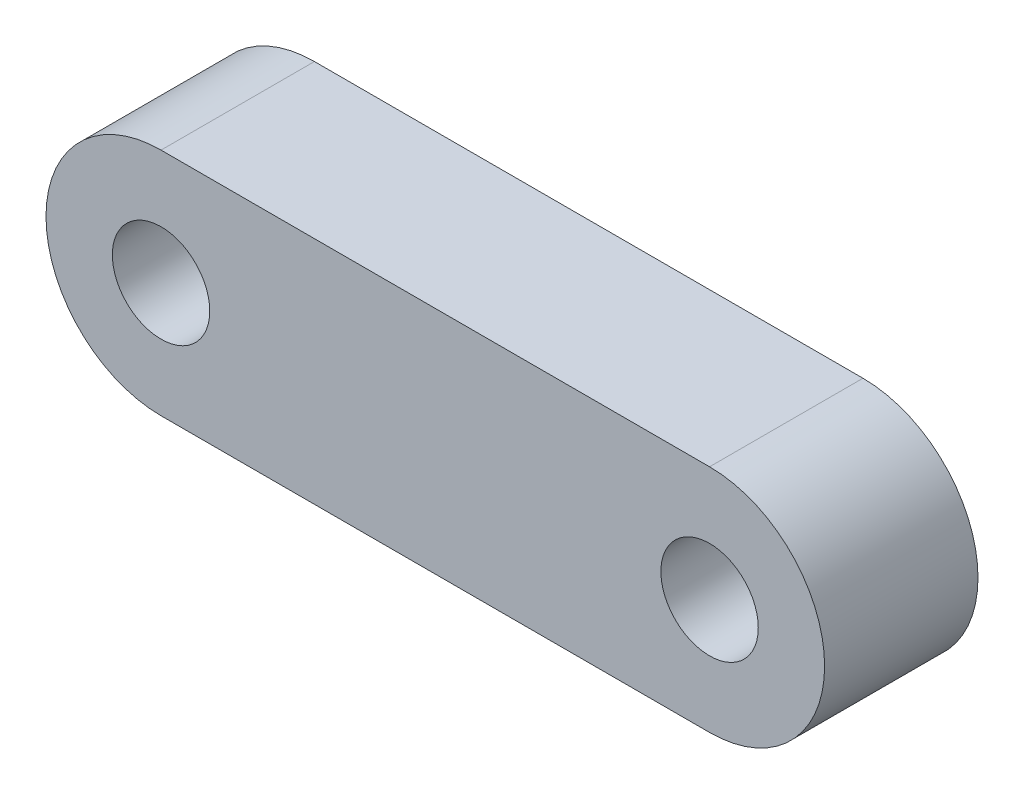
ISO-10303-21;
HEADER;
FILE_DESCRIPTION(('STEP AP214'),'2;1');
FILE_NAME('part.step','',(''),(''),'','','');
FILE_SCHEMA(('AUTOMOTIVE_DESIGN { 1 0 10303 214 1 1 1 1 }'));
ENDSEC;
DATA;
#1=APPLICATION_CONTEXT('core data for automotive mechanical design processes');
#2=APPLICATION_PROTOCOL_DEFINITION('international standard','automotive_design',2000,#1);
#3=PRODUCT_CONTEXT('',#1,'mechanical');
#4=PRODUCT('Part','Part','',(#3));
#5=PRODUCT_RELATED_PRODUCT_CATEGORY('part','',(#4));
#6=PRODUCT_DEFINITION_FORMATION('','',#4);
#7=PRODUCT_DEFINITION_CONTEXT('part definition',#1,'design');
#8=PRODUCT_DEFINITION('design','',#6,#7);
#9=PRODUCT_DEFINITION_SHAPE('','',#8);
#10=(LENGTH_UNIT() NAMED_UNIT(*) SI_UNIT(.MILLI.,.METRE.));
#11=(NAMED_UNIT(*) PLANE_ANGLE_UNIT() SI_UNIT($,.RADIAN.));
#12=(NAMED_UNIT(*) SI_UNIT($,.STERADIAN.) SOLID_ANGLE_UNIT());
#13=UNCERTAINTY_MEASURE_WITH_UNIT(LENGTH_MEASURE(1.E-05),#10,'distance_accuracy_value','');
#14=(GEOMETRIC_REPRESENTATION_CONTEXT(3) GLOBAL_UNCERTAINTY_ASSIGNED_CONTEXT((#13)) GLOBAL_UNIT_ASSIGNED_CONTEXT((#10,
#11,#12)) REPRESENTATION_CONTEXT('',''));
#15=CARTESIAN_POINT('',(0.,0.,0.));
#16=DIRECTION('',(0.,0.,1.));
#17=DIRECTION('',(1.,0.,0.));
#18=AXIS2_PLACEMENT_3D('',#15,#16,#17);
#19=CARTESIAN_POINT('',(-8.94,0.,2.5));
#20=DIRECTION('',(0.,0.,-1.));
#21=DIRECTION('',(-1.,0.,0.));
#22=AXIS2_PLACEMENT_3D('',#19,#20,#21);
#23=CYLINDRICAL_SURFACE('',#22,3.75);
#24=CARTESIAN_POINT('',(-8.94,0.,-2.5));
#25=DIRECTION('',(0.,0.,1.));
#26=DIRECTION('',(1.,0.,0.));
#27=AXIS2_PLACEMENT_3D('',#24,#25,#26);
#28=CIRCLE('',#27,3.75);
#29=CARTESIAN_POINT('',(-8.94,3.75,-2.5));
#30=VERTEX_POINT('',#29);
#31=CARTESIAN_POINT('',(-8.94,-3.75,-2.5));
#32=VERTEX_POINT('',#31);
#33=EDGE_CURVE('E107',#30,#32,#28,.T.);
#34=ORIENTED_EDGE('',*,*,#33,.T.);
#35=DIRECTION('',(0.,0.,-1.));
#36=VECTOR('',#35,1.);
#37=CARTESIAN_POINT('',(-8.94,-3.75,2.5));
#38=LINE('',#37,#36);
#39=CARTESIAN_POINT('',(-8.94,-3.75,2.5));
#40=VERTEX_POINT('',#39);
#41=EDGE_CURVE('E11',#40,#32,#38,.T.);
#42=ORIENTED_EDGE('',*,*,#41,.F.);
#43=CARTESIAN_POINT('',(-8.94,0.,2.5));
#44=DIRECTION('',(0.,0.,1.));
#45=DIRECTION('',(1.,0.,0.));
#46=AXIS2_PLACEMENT_3D('',#43,#44,#45);
#47=CIRCLE('',#46,3.75);
#48=CARTESIAN_POINT('',(-8.94,3.75,2.5));
#49=VERTEX_POINT('',#48);
#50=EDGE_CURVE('E91',#49,#40,#47,.T.);
#51=ORIENTED_EDGE('',*,*,#50,.F.);
#52=DIRECTION('',(0.,0.,-1.));
#53=VECTOR('',#52,1.);
#54=CARTESIAN_POINT('',(-8.94,3.75,2.5));
#55=LINE('',#54,#53);
#56=EDGE_CURVE('E103',#49,#30,#55,.T.);
#57=ORIENTED_EDGE('',*,*,#56,.T.);
#58=EDGE_LOOP('',(#34,#42,#51,#57));
#59=FACE_BOUND('',#58,.T.);
#60=ADVANCED_FACE('F39',(#59),#23,.T.);
#61=CARTESIAN_POINT('',(-8.94,-3.75,2.5));
#62=DIRECTION('',(0.,1.,0.));
#63=DIRECTION('',(0.,0.,1.));
#64=AXIS2_PLACEMENT_3D('',#61,#62,#63);
#65=PLANE('',#64);
#66=DIRECTION('',(1.,0.,0.));
#67=VECTOR('',#66,1.);
#68=CARTESIAN_POINT('',(-8.94,-3.75,-2.5));
#69=LINE('',#68,#67);
#70=CARTESIAN_POINT('',(8.94,-3.75,-2.5));
#71=VERTEX_POINT('',#70);
#72=EDGE_CURVE('E96',#32,#71,#69,.T.);
#73=ORIENTED_EDGE('',*,*,#72,.T.);
#74=DIRECTION('',(0.,0.,-1.));
#75=VECTOR('',#74,1.);
#76=CARTESIAN_POINT('',(8.94,-3.75,2.5));
#77=LINE('',#76,#75);
#78=CARTESIAN_POINT('',(8.94,-3.75,2.5));
#79=VERTEX_POINT('',#78);
#80=EDGE_CURVE('E48',#79,#71,#77,.T.);
#81=ORIENTED_EDGE('',*,*,#80,.F.);
#82=DIRECTION('',(1.,0.,0.));
#83=VECTOR('',#82,1.);
#84=CARTESIAN_POINT('',(-8.94,-3.75,2.5));
#85=LINE('',#84,#83);
#86=EDGE_CURVE('E86',#40,#79,#85,.T.);
#87=ORIENTED_EDGE('',*,*,#86,.F.);
#88=ORIENTED_EDGE('',*,*,#41,.T.);
#89=EDGE_LOOP('',(#73,#81,#87,#88));
#90=FACE_BOUND('',#89,.T.);
#91=ADVANCED_FACE('F95',(#90),#65,.F.);
#92=CARTESIAN_POINT('',(8.94,0.,2.5));
#93=DIRECTION('',(0.,0.,-1.));
#94=DIRECTION('',(-1.,0.,0.));
#95=AXIS2_PLACEMENT_3D('',#92,#93,#94);
#96=CYLINDRICAL_SURFACE('',#95,3.75);
#97=CARTESIAN_POINT('',(8.94,0.,-2.5));
#98=DIRECTION('',(0.,0.,1.));
#99=DIRECTION('',(1.,0.,0.));
#100=AXIS2_PLACEMENT_3D('',#97,#98,#99);
#101=CIRCLE('',#100,3.75);
#102=CARTESIAN_POINT('',(8.94,3.75,-2.5));
#103=VERTEX_POINT('',#102);
#104=EDGE_CURVE('E73',#71,#103,#101,.T.);
#105=ORIENTED_EDGE('',*,*,#104,.T.);
#106=DIRECTION('',(0.,0.,-1.));
#107=VECTOR('',#106,1.);
#108=CARTESIAN_POINT('',(8.94,3.75,2.5));
#109=LINE('',#108,#107);
#110=CARTESIAN_POINT('',(8.94,3.75,2.5));
#111=VERTEX_POINT('',#110);
#112=EDGE_CURVE('E98',#111,#103,#109,.T.);
#113=ORIENTED_EDGE('',*,*,#112,.F.);
#114=CARTESIAN_POINT('',(8.94,0.,2.5));
#115=DIRECTION('',(0.,0.,1.));
#116=DIRECTION('',(1.,0.,0.));
#117=AXIS2_PLACEMENT_3D('',#114,#115,#116);
#118=CIRCLE('',#117,3.75);
#119=EDGE_CURVE('E89',#79,#111,#118,.T.);
#120=ORIENTED_EDGE('',*,*,#119,.F.);
#121=ORIENTED_EDGE('',*,*,#80,.T.);
#122=EDGE_LOOP('',(#105,#113,#120,#121));
#123=FACE_BOUND('',#122,.T.);
#124=ADVANCED_FACE('F99',(#123),#96,.T.);
#125=CARTESIAN_POINT('',(-8.94,3.75,2.5));
#126=DIRECTION('',(0.,-1.,0.));
#127=DIRECTION('',(1.,0.,0.));
#128=AXIS2_PLACEMENT_3D('',#125,#126,#127);
#129=PLANE('',#128);
#130=DIRECTION('',(-1.,0.,0.));
#131=VECTOR('',#130,1.);
#132=CARTESIAN_POINT('',(-8.94,3.75,-2.5));
#133=LINE('',#132,#131);
#134=EDGE_CURVE('E79',#103,#30,#133,.T.);
#135=ORIENTED_EDGE('',*,*,#134,.T.);
#136=ORIENTED_EDGE('',*,*,#56,.F.);
#137=DIRECTION('',(-1.,0.,0.));
#138=VECTOR('',#137,1.);
#139=CARTESIAN_POINT('',(-8.94,3.75,2.5));
#140=LINE('',#139,#138);
#141=EDGE_CURVE('E56',#111,#49,#140,.T.);
#142=ORIENTED_EDGE('',*,*,#141,.F.);
#143=ORIENTED_EDGE('',*,*,#112,.T.);
#144=EDGE_LOOP('',(#135,#136,#142,#143));
#145=FACE_BOUND('',#144,.T.);
#146=ADVANCED_FACE('F121',(#145),#129,.F.);
#147=CARTESIAN_POINT('',(-8.94,0.,2.5));
#148=DIRECTION('',(0.,0.,1.));
#149=DIRECTION('',(1.,0.,0.));
#150=AXIS2_PLACEMENT_3D('',#147,#148,#149);
#151=PLANE('',#150);
#152=CARTESIAN_POINT('',(-8.94,0.,2.5));
#153=DIRECTION('',(0.,0.,1.));
#154=DIRECTION('',(1.,0.,0.));
#155=AXIS2_PLACEMENT_3D('',#152,#153,#154);
#156=CIRCLE('',#155,1.5875);
#157=CARTESIAN_POINT('',(-7.3525,0.,2.5));
#158=VERTEX_POINT('',#157);
#159=EDGE_CURVE('E136',#158,#158,#156,.T.);
#160=ORIENTED_EDGE('',*,*,#159,.F.);
#161=EDGE_LOOP('',(#160));
#162=FACE_BOUND('',#161,.T.);
#163=CARTESIAN_POINT('',(8.94,0.,2.5));
#164=DIRECTION('',(0.,0.,1.));
#165=DIRECTION('',(1.,0.,0.));
#166=AXIS2_PLACEMENT_3D('',#163,#164,#165);
#167=CIRCLE('',#166,1.5875);
#168=CARTESIAN_POINT('',(10.5275,0.,2.5));
#169=VERTEX_POINT('',#168);
#170=EDGE_CURVE('E128',#169,#169,#167,.T.);
#171=ORIENTED_EDGE('',*,*,#170,.F.);
#172=EDGE_LOOP('',(#171));
#173=FACE_BOUND('',#172,.T.);
#174=ORIENTED_EDGE('',*,*,#50,.T.);
#175=ORIENTED_EDGE('',*,*,#86,.T.);
#176=ORIENTED_EDGE('',*,*,#119,.T.);
#177=ORIENTED_EDGE('',*,*,#141,.T.);
#178=EDGE_LOOP('',(#174,#175,#176,#177));
#179=FACE_BOUND('',#178,.T.);
#180=ADVANCED_FACE('F87',(#162,#173,#179),#151,.T.);
#181=CARTESIAN_POINT('',(-8.94,0.,-2.5));
#182=DIRECTION('',(0.,0.,1.));
#183=DIRECTION('',(1.,0.,0.));
#184=AXIS2_PLACEMENT_3D('',#181,#182,#183);
#185=PLANE('',#184);
#186=CARTESIAN_POINT('',(-8.94,0.,-2.5));
#187=DIRECTION('',(0.,0.,1.));
#188=DIRECTION('',(1.,0.,0.));
#189=AXIS2_PLACEMENT_3D('',#186,#187,#188);
#190=CIRCLE('',#189,1.5875);
#191=CARTESIAN_POINT('',(-7.3525,0.,-2.5));
#192=VERTEX_POINT('',#191);
#193=EDGE_CURVE('E111',#192,#192,#190,.T.);
#194=ORIENTED_EDGE('',*,*,#193,.T.);
#195=EDGE_LOOP('',(#194));
#196=FACE_BOUND('',#195,.T.);
#197=CARTESIAN_POINT('',(8.94,0.,-2.5));
#198=DIRECTION('',(0.,0.,1.));
#199=DIRECTION('',(1.,0.,0.));
#200=AXIS2_PLACEMENT_3D('',#197,#198,#199);
#201=CIRCLE('',#200,1.5875);
#202=CARTESIAN_POINT('',(10.5275,0.,-2.5));
#203=VERTEX_POINT('',#202);
#204=EDGE_CURVE('E132',#203,#203,#201,.T.);
#205=ORIENTED_EDGE('',*,*,#204,.T.);
#206=EDGE_LOOP('',(#205));
#207=FACE_BOUND('',#206,.T.);
#208=ORIENTED_EDGE('',*,*,#33,.F.);
#209=ORIENTED_EDGE('',*,*,#134,.F.);
#210=ORIENTED_EDGE('',*,*,#104,.F.);
#211=ORIENTED_EDGE('',*,*,#72,.F.);
#212=EDGE_LOOP('',(#208,#209,#210,#211));
#213=FACE_BOUND('',#212,.T.);
#214=ADVANCED_FACE('F124',(#196,#207,#213),#185,.F.);
#215=CARTESIAN_POINT('',(8.94,0.,-2.5));
#216=DIRECTION('',(0.,0.,1.));
#217=DIRECTION('',(1.,0.,0.));
#218=AXIS2_PLACEMENT_3D('',#215,#216,#217);
#219=CYLINDRICAL_SURFACE('',#218,1.5875);
#220=ORIENTED_EDGE('',*,*,#204,.F.);
#221=EDGE_LOOP('',(#220));
#222=FACE_BOUND('',#221,.T.);
#223=ORIENTED_EDGE('',*,*,#170,.T.);
#224=EDGE_LOOP('',(#223));
#225=FACE_BOUND('',#224,.T.);
#226=ADVANCED_FACE('F149',(#222,#225),#219,.F.);
#227=CARTESIAN_POINT('',(-8.94,0.,-2.5));
#228=DIRECTION('',(0.,0.,1.));
#229=DIRECTION('',(1.,0.,0.));
#230=AXIS2_PLACEMENT_3D('',#227,#228,#229);
#231=CYLINDRICAL_SURFACE('',#230,1.5875);
#232=ORIENTED_EDGE('',*,*,#193,.F.);
#233=EDGE_LOOP('',(#232));
#234=FACE_BOUND('',#233,.T.);
#235=ORIENTED_EDGE('',*,*,#159,.T.);
#236=EDGE_LOOP('',(#235));
#237=FACE_BOUND('',#236,.T.);
#238=ADVANCED_FACE('F146',(#234,#237),#231,.F.);
#239=CLOSED_SHELL('',(#60,#91,#124,#146,#180,#214,#226,#238));
#240=MANIFOLD_SOLID_BREP('B2',#239);
#241=ADVANCED_BREP_SHAPE_REPRESENTATION('',(#18,#240),#14);
#242=SHAPE_DEFINITION_REPRESENTATION(#9,#241);
ENDSEC;
END-ISO-10303-21;
